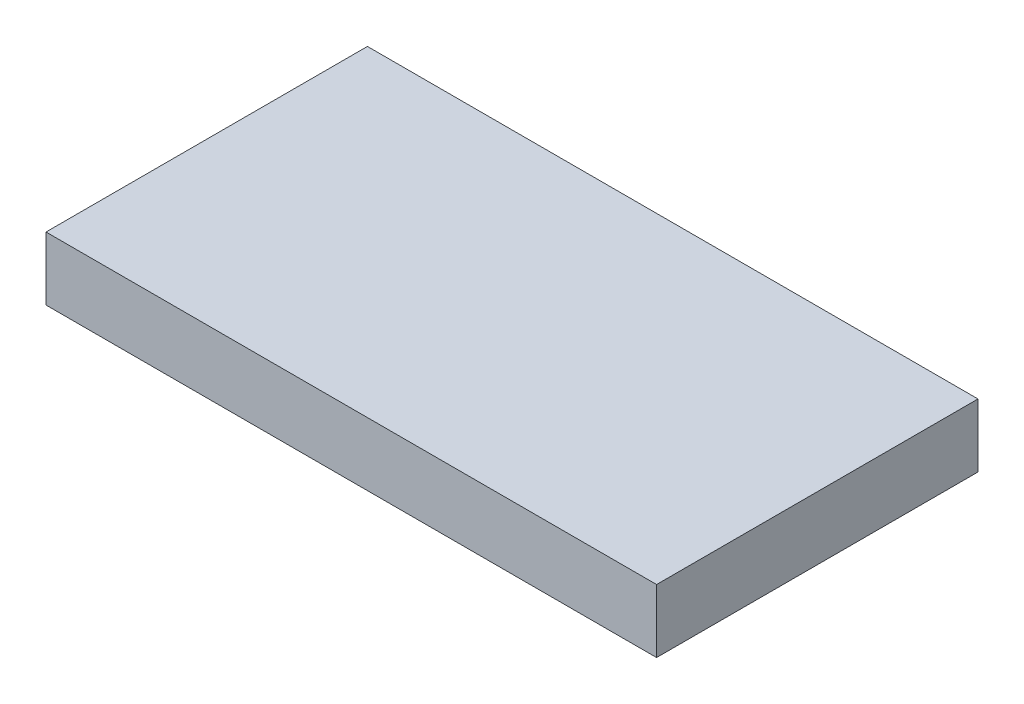
ISO-10303-21;
HEADER;
FILE_DESCRIPTION(('STEP AP214'),'2;1');
FILE_NAME('part.step','',(''),(''),'','','');
FILE_SCHEMA(('AUTOMOTIVE_DESIGN { 1 0 10303 214 1 1 1 1 }'));
ENDSEC;
DATA;
#1=APPLICATION_CONTEXT('core data for automotive mechanical design processes');
#2=APPLICATION_PROTOCOL_DEFINITION('international standard','automotive_design',2000,#1);
#3=PRODUCT_CONTEXT('',#1,'mechanical');
#4=PRODUCT('Part','Part','',(#3));
#5=PRODUCT_RELATED_PRODUCT_CATEGORY('part','',(#4));
#6=PRODUCT_DEFINITION_FORMATION('','',#4);
#7=PRODUCT_DEFINITION_CONTEXT('part definition',#1,'design');
#8=PRODUCT_DEFINITION('design','',#6,#7);
#9=PRODUCT_DEFINITION_SHAPE('','',#8);
#10=(LENGTH_UNIT() NAMED_UNIT(*) SI_UNIT(.MILLI.,.METRE.));
#11=(NAMED_UNIT(*) PLANE_ANGLE_UNIT() SI_UNIT($,.RADIAN.));
#12=(NAMED_UNIT(*) SI_UNIT($,.STERADIAN.) SOLID_ANGLE_UNIT());
#13=UNCERTAINTY_MEASURE_WITH_UNIT(LENGTH_MEASURE(1.E-05),#10,'distance_accuracy_value','');
#14=(GEOMETRIC_REPRESENTATION_CONTEXT(3) GLOBAL_UNCERTAINTY_ASSIGNED_CONTEXT((#13)) GLOBAL_UNIT_ASSIGNED_CONTEXT((#10,
#11,#12)) REPRESENTATION_CONTEXT('',''));
#15=CARTESIAN_POINT('',(0.,0.,0.));
#16=DIRECTION('',(0.,0.,1.));
#17=DIRECTION('',(1.,0.,0.));
#18=AXIS2_PLACEMENT_3D('',#15,#16,#17);
#19=CARTESIAN_POINT('',(482.5,100.,-254.));
#20=DIRECTION('',(-1.,0.,0.));
#21=DIRECTION('',(0.,0.,1.));
#22=AXIS2_PLACEMENT_3D('',#19,#20,#21);
#23=PLANE('',#22);
#24=DIRECTION('',(0.,0.,-1.));
#25=VECTOR('',#24,1.);
#26=CARTESIAN_POINT('',(482.5,0.,-254.));
#27=LINE('',#26,#25);
#28=CARTESIAN_POINT('',(482.5,0.,254.));
#29=VERTEX_POINT('',#28);
#30=CARTESIAN_POINT('',(482.5,0.,-254.));
#31=VERTEX_POINT('',#30);
#32=EDGE_CURVE('E107',#29,#31,#27,.T.);
#33=ORIENTED_EDGE('',*,*,#32,.T.);
#34=DIRECTION('',(0.,-1.,0.));
#35=VECTOR('',#34,1.);
#36=CARTESIAN_POINT('',(482.5,100.,-254.));
#37=LINE('',#36,#35);
#38=CARTESIAN_POINT('',(482.5,100.,-254.));
#39=VERTEX_POINT('',#38);
#40=EDGE_CURVE('E11',#39,#31,#37,.T.);
#41=ORIENTED_EDGE('',*,*,#40,.F.);
#42=DIRECTION('',(0.,0.,-1.));
#43=VECTOR('',#42,1.);
#44=CARTESIAN_POINT('',(482.5,100.,-254.));
#45=LINE('',#44,#43);
#46=CARTESIAN_POINT('',(482.5,100.,254.));
#47=VERTEX_POINT('',#46);
#48=EDGE_CURVE('E91',#47,#39,#45,.T.);
#49=ORIENTED_EDGE('',*,*,#48,.F.);
#50=DIRECTION('',(0.,-1.,0.));
#51=VECTOR('',#50,1.);
#52=CARTESIAN_POINT('',(482.5,100.,254.));
#53=LINE('',#52,#51);
#54=EDGE_CURVE('E103',#47,#29,#53,.T.);
#55=ORIENTED_EDGE('',*,*,#54,.T.);
#56=EDGE_LOOP('',(#33,#41,#49,#55));
#57=FACE_BOUND('',#56,.T.);
#58=ADVANCED_FACE('F39',(#57),#23,.F.);
#59=CARTESIAN_POINT('',(-482.5,100.,-254.));
#60=DIRECTION('',(0.,0.,1.));
#61=DIRECTION('',(1.,0.,0.));
#62=AXIS2_PLACEMENT_3D('',#59,#60,#61);
#63=PLANE('',#62);
#64=DIRECTION('',(-1.,0.,0.));
#65=VECTOR('',#64,1.);
#66=CARTESIAN_POINT('',(-482.5,0.,-254.));
#67=LINE('',#66,#65);
#68=CARTESIAN_POINT('',(-482.5,0.,-254.));
#69=VERTEX_POINT('',#68);
#70=EDGE_CURVE('E96',#31,#69,#67,.T.);
#71=ORIENTED_EDGE('',*,*,#70,.T.);
#72=DIRECTION('',(0.,-1.,0.));
#73=VECTOR('',#72,1.);
#74=CARTESIAN_POINT('',(-482.5,100.,-254.));
#75=LINE('',#74,#73);
#76=CARTESIAN_POINT('',(-482.5,100.,-254.));
#77=VERTEX_POINT('',#76);
#78=EDGE_CURVE('E48',#77,#69,#75,.T.);
#79=ORIENTED_EDGE('',*,*,#78,.F.);
#80=DIRECTION('',(-1.,0.,0.));
#81=VECTOR('',#80,1.);
#82=CARTESIAN_POINT('',(-482.5,100.,-254.));
#83=LINE('',#82,#81);
#84=EDGE_CURVE('E86',#39,#77,#83,.T.);
#85=ORIENTED_EDGE('',*,*,#84,.F.);
#86=ORIENTED_EDGE('',*,*,#40,.T.);
#87=EDGE_LOOP('',(#71,#79,#85,#86));
#88=FACE_BOUND('',#87,.T.);
#89=ADVANCED_FACE('F95',(#88),#63,.F.);
#90=CARTESIAN_POINT('',(-482.5,100.,-254.));
#91=DIRECTION('',(1.,0.,0.));
#92=DIRECTION('',(0.,0.,-1.));
#93=AXIS2_PLACEMENT_3D('',#90,#91,#92);
#94=PLANE('',#93);
#95=DIRECTION('',(0.,0.,1.));
#96=VECTOR('',#95,1.);
#97=CARTESIAN_POINT('',(-482.5,0.,-254.));
#98=LINE('',#97,#96);
#99=CARTESIAN_POINT('',(-482.5,0.,254.));
#100=VERTEX_POINT('',#99);
#101=EDGE_CURVE('E73',#69,#100,#98,.T.);
#102=ORIENTED_EDGE('',*,*,#101,.T.);
#103=DIRECTION('',(0.,-1.,0.));
#104=VECTOR('',#103,1.);
#105=CARTESIAN_POINT('',(-482.5,100.,254.));
#106=LINE('',#105,#104);
#107=CARTESIAN_POINT('',(-482.5,100.,254.));
#108=VERTEX_POINT('',#107);
#109=EDGE_CURVE('E98',#108,#100,#106,.T.);
#110=ORIENTED_EDGE('',*,*,#109,.F.);
#111=DIRECTION('',(0.,0.,1.));
#112=VECTOR('',#111,1.);
#113=CARTESIAN_POINT('',(-482.5,100.,-254.));
#114=LINE('',#113,#112);
#115=EDGE_CURVE('E89',#77,#108,#114,.T.);
#116=ORIENTED_EDGE('',*,*,#115,.F.);
#117=ORIENTED_EDGE('',*,*,#78,.T.);
#118=EDGE_LOOP('',(#102,#110,#116,#117));
#119=FACE_BOUND('',#118,.T.);
#120=ADVANCED_FACE('F99',(#119),#94,.F.);
#121=CARTESIAN_POINT('',(-482.5,100.,254.));
#122=DIRECTION('',(0.,0.,-1.));
#123=DIRECTION('',(-1.,0.,0.));
#124=AXIS2_PLACEMENT_3D('',#121,#122,#123);
#125=PLANE('',#124);
#126=DIRECTION('',(1.,0.,0.));
#127=VECTOR('',#126,1.);
#128=CARTESIAN_POINT('',(-482.5,0.,254.));
#129=LINE('',#128,#127);
#130=EDGE_CURVE('E79',#100,#29,#129,.T.);
#131=ORIENTED_EDGE('',*,*,#130,.T.);
#132=ORIENTED_EDGE('',*,*,#54,.F.);
#133=DIRECTION('',(1.,0.,0.));
#134=VECTOR('',#133,1.);
#135=CARTESIAN_POINT('',(-482.5,100.,254.));
#136=LINE('',#135,#134);
#137=EDGE_CURVE('E56',#108,#47,#136,.T.);
#138=ORIENTED_EDGE('',*,*,#137,.F.);
#139=ORIENTED_EDGE('',*,*,#109,.T.);
#140=EDGE_LOOP('',(#131,#132,#138,#139));
#141=FACE_BOUND('',#140,.T.);
#142=ADVANCED_FACE('F121',(#141),#125,.F.);
#143=CARTESIAN_POINT('',(0.,100.,0.));
#144=DIRECTION('',(0.,1.,0.));
#145=DIRECTION('',(0.,0.,1.));
#146=AXIS2_PLACEMENT_3D('',#143,#144,#145);
#147=PLANE('',#146);
#148=ORIENTED_EDGE('',*,*,#48,.T.);
#149=ORIENTED_EDGE('',*,*,#84,.T.);
#150=ORIENTED_EDGE('',*,*,#115,.T.);
#151=ORIENTED_EDGE('',*,*,#137,.T.);
#152=EDGE_LOOP('',(#148,#149,#150,#151));
#153=FACE_BOUND('',#152,.T.);
#154=ADVANCED_FACE('F87',(#153),#147,.T.);
#155=CARTESIAN_POINT('',(0.,0.,0.));
#156=DIRECTION('',(0.,1.,0.));
#157=DIRECTION('',(0.,0.,1.));
#158=AXIS2_PLACEMENT_3D('',#155,#156,#157);
#159=PLANE('',#158);
#160=CARTESIAN_POINT('',(-254.,0.,204.));
#161=DIRECTION('',(0.,1.,0.));
#162=DIRECTION('',(0.,0.,-1.));
#163=AXIS2_PLACEMENT_3D('',#160,#161,#162);
#164=CIRCLE('',#163,20.);
#165=CARTESIAN_POINT('',(-254.,0.,184.));
#166=VERTEX_POINT('',#165);
#167=EDGE_CURVE('E152',#166,#166,#164,.T.);
#168=ORIENTED_EDGE('',*,*,#167,.T.);
#169=EDGE_LOOP('',(#168));
#170=FACE_BOUND('',#169,.T.);
#171=CARTESIAN_POINT('',(-254.,0.,-204.));
#172=DIRECTION('',(0.,1.,0.));
#173=DIRECTION('',(0.,0.,-1.));
#174=AXIS2_PLACEMENT_3D('',#171,#172,#173);
#175=CIRCLE('',#174,20.);
#176=CARTESIAN_POINT('',(-254.,0.,-224.));
#177=VERTEX_POINT('',#176);
#178=EDGE_CURVE('E144',#177,#177,#175,.T.);
#179=ORIENTED_EDGE('',*,*,#178,.T.);
#180=EDGE_LOOP('',(#179));
#181=FACE_BOUND('',#180,.T.);
#182=CARTESIAN_POINT('',(254.,0.,204.));
#183=DIRECTION('',(0.,-1.,0.));
#184=DIRECTION('',(0.,0.,-1.));
#185=AXIS2_PLACEMENT_3D('',#182,#183,#184);
#186=CIRCLE('',#185,20.);
#187=CARTESIAN_POINT('',(254.,0.,184.));
#188=VERTEX_POINT('',#187);
#189=EDGE_CURVE('E137',#188,#188,#186,.T.);
#190=ORIENTED_EDGE('',*,*,#189,.F.);
#191=EDGE_LOOP('',(#190));
#192=FACE_BOUND('',#191,.T.);
#193=CARTESIAN_POINT('',(254.,0.,-204.));
#194=DIRECTION('',(0.,-1.,0.));
#195=DIRECTION('',(0.,0.,-1.));
#196=AXIS2_PLACEMENT_3D('',#193,#194,#195);
#197=CIRCLE('',#196,20.);
#198=CARTESIAN_POINT('',(254.,0.,-224.));
#199=VERTEX_POINT('',#198);
#200=EDGE_CURVE('E128',#199,#199,#197,.T.);
#201=ORIENTED_EDGE('',*,*,#200,.F.);
#202=EDGE_LOOP('',(#201));
#203=FACE_BOUND('',#202,.T.);
#204=ORIENTED_EDGE('',*,*,#32,.F.);
#205=ORIENTED_EDGE('',*,*,#130,.F.);
#206=ORIENTED_EDGE('',*,*,#101,.F.);
#207=ORIENTED_EDGE('',*,*,#70,.F.);
#208=EDGE_LOOP('',(#204,#205,#206,#207));
#209=FACE_BOUND('',#208,.T.);
#210=ADVANCED_FACE('F124',(#170,#181,#192,#203,#209),#159,.F.);
#211=CARTESIAN_POINT('',(254.,50.,-204.));
#212=DIRECTION('',(0.,-1.,0.));
#213=DIRECTION('',(0.,0.,-1.));
#214=AXIS2_PLACEMENT_3D('',#211,#212,#213);
#215=CYLINDRICAL_SURFACE('',#214,20.);
#216=CARTESIAN_POINT('',(254.,50.,-204.));
#217=DIRECTION('',(0.,-1.,0.));
#218=DIRECTION('',(0.,0.,-1.));
#219=AXIS2_PLACEMENT_3D('',#216,#217,#218);
#220=CIRCLE('',#219,20.);
#221=CARTESIAN_POINT('',(254.,50.,-224.));
#222=VERTEX_POINT('',#221);
#223=EDGE_CURVE('E132',#222,#222,#220,.T.);
#224=ORIENTED_EDGE('',*,*,#223,.F.);
#225=EDGE_LOOP('',(#224));
#226=FACE_BOUND('',#225,.T.);
#227=ORIENTED_EDGE('',*,*,#200,.T.);
#228=EDGE_LOOP('',(#227));
#229=FACE_BOUND('',#228,.T.);
#230=ADVANCED_FACE('F184',(#226,#229),#215,.F.);
#231=CARTESIAN_POINT('',(254.,50.,-204.));
#232=DIRECTION('',(0.,-1.,0.));
#233=DIRECTION('',(0.,0.,-1.));
#234=AXIS2_PLACEMENT_3D('',#231,#232,#233);
#235=PLANE('',#234);
#236=ORIENTED_EDGE('',*,*,#223,.T.);
#237=EDGE_LOOP('',(#236));
#238=FACE_BOUND('',#237,.T.);
#239=ADVANCED_FACE('F190',(#238),#235,.T.);
#240=CARTESIAN_POINT('',(254.,50.,204.));
#241=DIRECTION('',(0.,-1.,0.));
#242=DIRECTION('',(0.,0.,-1.));
#243=AXIS2_PLACEMENT_3D('',#240,#241,#242);
#244=CYLINDRICAL_SURFACE('',#243,20.);
#245=CARTESIAN_POINT('',(254.,50.,204.));
#246=DIRECTION('',(0.,-1.,0.));
#247=DIRECTION('',(0.,0.,-1.));
#248=AXIS2_PLACEMENT_3D('',#245,#246,#247);
#249=CIRCLE('',#248,20.);
#250=CARTESIAN_POINT('',(254.,50.,184.));
#251=VERTEX_POINT('',#250);
#252=EDGE_CURVE('E111',#251,#251,#249,.T.);
#253=ORIENTED_EDGE('',*,*,#252,.F.);
#254=EDGE_LOOP('',(#253));
#255=FACE_BOUND('',#254,.T.);
#256=ORIENTED_EDGE('',*,*,#189,.T.);
#257=EDGE_LOOP('',(#256));
#258=FACE_BOUND('',#257,.T.);
#259=ADVANCED_FACE('F194',(#255,#258),#244,.F.);
#260=CARTESIAN_POINT('',(254.,50.,204.));
#261=DIRECTION('',(0.,-1.,0.));
#262=DIRECTION('',(0.,0.,-1.));
#263=AXIS2_PLACEMENT_3D('',#260,#261,#262);
#264=PLANE('',#263);
#265=ORIENTED_EDGE('',*,*,#252,.T.);
#266=EDGE_LOOP('',(#265));
#267=FACE_BOUND('',#266,.T.);
#268=ADVANCED_FACE('F198',(#267),#264,.T.);
#269=CARTESIAN_POINT('',(-254.,50.,-204.));
#270=DIRECTION('',(0.,-1.,0.));
#271=DIRECTION('',(0.,0.,-1.));
#272=AXIS2_PLACEMENT_3D('',#269,#270,#271);
#273=CYLINDRICAL_SURFACE('',#272,20.);
#274=CARTESIAN_POINT('',(-254.,50.,-204.));
#275=DIRECTION('',(0.,1.,0.));
#276=DIRECTION('',(0.,0.,-1.));
#277=AXIS2_PLACEMENT_3D('',#274,#275,#276);
#278=CIRCLE('',#277,20.);
#279=CARTESIAN_POINT('',(-254.,50.,-224.));
#280=VERTEX_POINT('',#279);
#281=EDGE_CURVE('E148',#280,#280,#278,.T.);
#282=ORIENTED_EDGE('',*,*,#281,.T.);
#283=EDGE_LOOP('',(#282));
#284=FACE_BOUND('',#283,.T.);
#285=ORIENTED_EDGE('',*,*,#178,.F.);
#286=EDGE_LOOP('',(#285));
#287=FACE_BOUND('',#286,.T.);
#288=ADVANCED_FACE('F202',(#284,#287),#273,.F.);
#289=CARTESIAN_POINT('',(-254.,50.,-204.));
#290=DIRECTION('',(0.,-1.,0.));
#291=DIRECTION('',(0.,0.,-1.));
#292=AXIS2_PLACEMENT_3D('',#289,#290,#291);
#293=PLANE('',#292);
#294=ORIENTED_EDGE('',*,*,#281,.F.);
#295=EDGE_LOOP('',(#294));
#296=FACE_BOUND('',#295,.T.);
#297=ADVANCED_FACE('F169',(#296),#293,.T.);
#298=CARTESIAN_POINT('',(-254.,50.,204.));
#299=DIRECTION('',(0.,-1.,0.));
#300=DIRECTION('',(0.,0.,-1.));
#301=AXIS2_PLACEMENT_3D('',#298,#299,#300);
#302=CYLINDRICAL_SURFACE('',#301,20.);
#303=CARTESIAN_POINT('',(-254.,50.,204.));
#304=DIRECTION('',(0.,1.,0.));
#305=DIRECTION('',(0.,0.,-1.));
#306=AXIS2_PLACEMENT_3D('',#303,#304,#305);
#307=CIRCLE('',#306,20.);
#308=CARTESIAN_POINT('',(-254.,50.,184.));
#309=VERTEX_POINT('',#308);
#310=EDGE_CURVE('E133',#309,#309,#307,.T.);
#311=ORIENTED_EDGE('',*,*,#310,.T.);
#312=EDGE_LOOP('',(#311));
#313=FACE_BOUND('',#312,.T.);
#314=ORIENTED_EDGE('',*,*,#167,.F.);
#315=EDGE_LOOP('',(#314));
#316=FACE_BOUND('',#315,.T.);
#317=ADVANCED_FACE('F160',(#313,#316),#302,.F.);
#318=CARTESIAN_POINT('',(-254.,50.,204.));
#319=DIRECTION('',(0.,-1.,0.));
#320=DIRECTION('',(0.,0.,-1.));
#321=AXIS2_PLACEMENT_3D('',#318,#319,#320);
#322=PLANE('',#321);
#323=ORIENTED_EDGE('',*,*,#310,.F.);
#324=EDGE_LOOP('',(#323));
#325=FACE_BOUND('',#324,.T.);
#326=ADVANCED_FACE('F163',(#325),#322,.T.);
#327=CLOSED_SHELL('',(#58,#89,#120,#142,#154,#210,#230,#239,#259,#268,#288,#297,#317,#326));
#328=MANIFOLD_SOLID_BREP('B2',#327);
#329=ADVANCED_BREP_SHAPE_REPRESENTATION('',(#18,#328),#14);
#330=SHAPE_DEFINITION_REPRESENTATION(#9,#329);
ENDSEC;
END-ISO-10303-21;
